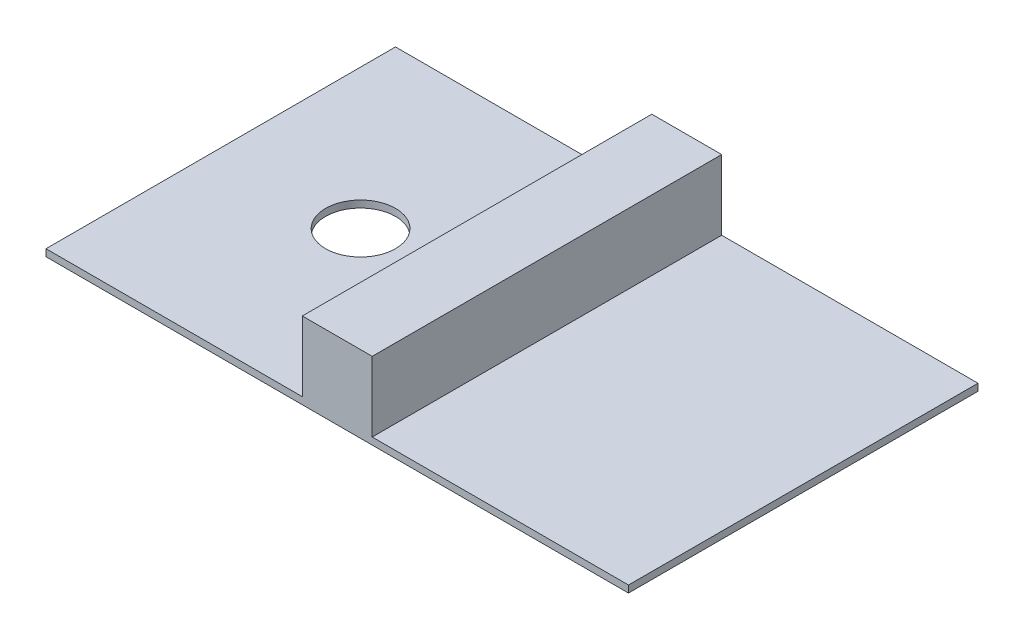
ISO-10303-21;
HEADER;
FILE_DESCRIPTION(('STEP AP214'),'2;1');
FILE_NAME('part.step','',(''),(''),'','','');
FILE_SCHEMA(('AUTOMOTIVE_DESIGN { 1 0 10303 214 1 1 1 1 }'));
ENDSEC;
DATA;
#1=APPLICATION_CONTEXT('core data for automotive mechanical design processes');
#2=APPLICATION_PROTOCOL_DEFINITION('international standard','automotive_design',2000,#1);
#3=PRODUCT_CONTEXT('',#1,'mechanical');
#4=PRODUCT('Part','Part','',(#3));
#5=PRODUCT_RELATED_PRODUCT_CATEGORY('part','',(#4));
#6=PRODUCT_DEFINITION_FORMATION('','',#4);
#7=PRODUCT_DEFINITION_CONTEXT('part definition',#1,'design');
#8=PRODUCT_DEFINITION('design','',#6,#7);
#9=PRODUCT_DEFINITION_SHAPE('','',#8);
#10=(LENGTH_UNIT() NAMED_UNIT(*) SI_UNIT(.MILLI.,.METRE.));
#11=(NAMED_UNIT(*) PLANE_ANGLE_UNIT() SI_UNIT($,.RADIAN.));
#12=(NAMED_UNIT(*) SI_UNIT($,.STERADIAN.) SOLID_ANGLE_UNIT());
#13=UNCERTAINTY_MEASURE_WITH_UNIT(LENGTH_MEASURE(1.E-05),#10,'distance_accuracy_value','');
#14=(GEOMETRIC_REPRESENTATION_CONTEXT(3) GLOBAL_UNCERTAINTY_ASSIGNED_CONTEXT((#13)) GLOBAL_UNIT_ASSIGNED_CONTEXT((#10,
#11,#12)) REPRESENTATION_CONTEXT('',''));
#15=CARTESIAN_POINT('',(0.,0.,0.));
#16=DIRECTION('',(0.,0.,1.));
#17=DIRECTION('',(1.,0.,0.));
#18=AXIS2_PLACEMENT_3D('',#15,#16,#17);
#19=CARTESIAN_POINT('',(0.,0.3,0.));
#20=DIRECTION('',(0.,-1.,0.));
#21=DIRECTION('',(0.,0.,-1.));
#22=AXIS2_PLACEMENT_3D('',#19,#20,#21);
#23=PLANE('',#22);
#24=CARTESIAN_POINT('',(6.,0.3,-7.5));
#25=DIRECTION('',(0.,1.,0.));
#26=DIRECTION('',(0.,0.,1.));
#27=AXIS2_PLACEMENT_3D('',#24,#25,#26);
#28=CIRCLE('',#27,1.5);
#29=CARTESIAN_POINT('',(6.,0.3,-6.));
#30=VERTEX_POINT('',#29);
#31=EDGE_CURVE('E127',#30,#30,#28,.T.);
#32=ORIENTED_EDGE('',*,*,#31,.F.);
#33=EDGE_LOOP('',(#32));
#34=FACE_BOUND('',#33,.T.);
#35=DIRECTION('',(0.,0.,1.));
#36=VECTOR('',#35,1.);
#37=CARTESIAN_POINT('',(11.,0.3,0.));
#38=LINE('',#37,#36);
#39=CARTESIAN_POINT('',(11.,0.3,-15.));
#40=VERTEX_POINT('',#39);
#41=CARTESIAN_POINT('',(11.,0.3,0.));
#42=VERTEX_POINT('',#41);
#43=EDGE_CURVE('E51',#40,#42,#38,.T.);
#44=ORIENTED_EDGE('',*,*,#43,.F.);
#45=DIRECTION('',(-1.,0.,0.));
#46=VECTOR('',#45,1.);
#47=CARTESIAN_POINT('',(0.,0.3,-15.));
#48=LINE('',#47,#46);
#49=CARTESIAN_POINT('',(0.,0.3,-15.));
#50=VERTEX_POINT('',#49);
#51=EDGE_CURVE('E147',#40,#50,#48,.T.);
#52=ORIENTED_EDGE('',*,*,#51,.T.);
#53=DIRECTION('',(0.,0.,1.));
#54=VECTOR('',#53,1.);
#55=CARTESIAN_POINT('',(0.,0.3,0.));
#56=LINE('',#55,#54);
#57=CARTESIAN_POINT('',(0.,0.3,0.));
#58=VERTEX_POINT('',#57);
#59=EDGE_CURVE('E138',#50,#58,#56,.T.);
#60=ORIENTED_EDGE('',*,*,#59,.T.);
#61=DIRECTION('',(1.,0.,0.));
#62=VECTOR('',#61,1.);
#63=CARTESIAN_POINT('',(0.,0.3,0.));
#64=LINE('',#63,#62);
#65=EDGE_CURVE('E143',#58,#42,#64,.T.);
#66=ORIENTED_EDGE('',*,*,#65,.T.);
#67=EDGE_LOOP('',(#44,#52,#60,#66));
#68=FACE_BOUND('',#67,.T.);
#69=ADVANCED_FACE('F35',(#34,#68),#23,.F.);
#70=CARTESIAN_POINT('',(0.,0.3,0.));
#71=DIRECTION('',(1.,0.,0.));
#72=DIRECTION('',(0.,0.,-1.));
#73=AXIS2_PLACEMENT_3D('',#70,#71,#72);
#74=PLANE('',#73);
#75=DIRECTION('',(0.,0.,1.));
#76=VECTOR('',#75,1.);
#77=CARTESIAN_POINT('',(0.,0.,0.));
#78=LINE('',#77,#76);
#79=CARTESIAN_POINT('',(0.,0.,-15.));
#80=VERTEX_POINT('',#79);
#81=CARTESIAN_POINT('',(0.,0.,0.));
#82=VERTEX_POINT('',#81);
#83=EDGE_CURVE('E109',#80,#82,#78,.T.);
#84=ORIENTED_EDGE('',*,*,#83,.T.);
#85=DIRECTION('',(0.,-1.,0.));
#86=VECTOR('',#85,1.);
#87=CARTESIAN_POINT('',(0.,0.3,0.));
#88=LINE('',#87,#86);
#89=EDGE_CURVE('E11',#58,#82,#88,.T.);
#90=ORIENTED_EDGE('',*,*,#89,.F.);
#91=ORIENTED_EDGE('',*,*,#59,.F.);
#92=DIRECTION('',(0.,-1.,0.));
#93=VECTOR('',#92,1.);
#94=CARTESIAN_POINT('',(0.,0.3,-15.));
#95=LINE('',#94,#93);
#96=EDGE_CURVE('E149',#50,#80,#95,.T.);
#97=ORIENTED_EDGE('',*,*,#96,.T.);
#98=EDGE_LOOP('',(#84,#90,#91,#97));
#99=FACE_BOUND('',#98,.T.);
#100=ADVANCED_FACE('F37',(#99),#74,.F.);
#101=CARTESIAN_POINT('',(0.,0.3,0.));
#102=DIRECTION('',(0.,0.,-1.));
#103=DIRECTION('',(-1.,0.,0.));
#104=AXIS2_PLACEMENT_3D('',#101,#102,#103);
#105=PLANE('',#104);
#106=DIRECTION('',(1.,0.,0.));
#107=VECTOR('',#106,1.);
#108=CARTESIAN_POINT('',(0.,0.,0.));
#109=LINE('',#108,#107);
#110=CARTESIAN_POINT('',(25.,0.,0.));
#111=VERTEX_POINT('',#110);
#112=EDGE_CURVE('E152',#82,#111,#109,.T.);
#113=ORIENTED_EDGE('',*,*,#112,.T.);
#114=DIRECTION('',(0.,-1.,0.));
#115=VECTOR('',#114,1.);
#116=CARTESIAN_POINT('',(25.,0.3,0.));
#117=LINE('',#116,#115);
#118=CARTESIAN_POINT('',(25.,0.3,0.));
#119=VERTEX_POINT('',#118);
#120=EDGE_CURVE('E44',#119,#111,#117,.T.);
#121=ORIENTED_EDGE('',*,*,#120,.F.);
#122=CARTESIAN_POINT('',(14.,0.3,0.));
#123=VERTEX_POINT('',#122);
#124=EDGE_CURVE('E141',#123,#119,#64,.T.);
#125=ORIENTED_EDGE('',*,*,#124,.F.);
#126=DIRECTION('',(0.,-1.,0.));
#127=VECTOR('',#126,1.);
#128=CARTESIAN_POINT('',(14.,3.3,0.));
#129=LINE('',#128,#127);
#130=CARTESIAN_POINT('',(14.,3.3,0.));
#131=VERTEX_POINT('',#130);
#132=EDGE_CURVE('E131',#131,#123,#129,.T.);
#133=ORIENTED_EDGE('',*,*,#132,.F.);
#134=DIRECTION('',(1.,0.,0.));
#135=VECTOR('',#134,1.);
#136=CARTESIAN_POINT('',(0.,3.3,0.));
#137=LINE('',#136,#135);
#138=CARTESIAN_POINT('',(11.,3.3,0.));
#139=VERTEX_POINT('',#138);
#140=EDGE_CURVE('E122',#139,#131,#137,.T.);
#141=ORIENTED_EDGE('',*,*,#140,.F.);
#142=DIRECTION('',(0.,-1.,0.));
#143=VECTOR('',#142,1.);
#144=CARTESIAN_POINT('',(11.,3.3,0.));
#145=LINE('',#144,#143);
#146=EDGE_CURVE('E134',#139,#42,#145,.T.);
#147=ORIENTED_EDGE('',*,*,#146,.T.);
#148=ORIENTED_EDGE('',*,*,#65,.F.);
#149=ORIENTED_EDGE('',*,*,#89,.T.);
#150=EDGE_LOOP('',(#113,#121,#125,#133,#141,#147,#148,#149));
#151=FACE_BOUND('',#150,.T.);
#152=ADVANCED_FACE('F182',(#151),#105,.F.);
#153=CARTESIAN_POINT('',(25.,0.3,0.));
#154=DIRECTION('',(-1.,0.,0.));
#155=DIRECTION('',(0.,0.,1.));
#156=AXIS2_PLACEMENT_3D('',#153,#154,#155);
#157=PLANE('',#156);
#158=DIRECTION('',(0.,0.,-1.));
#159=VECTOR('',#158,1.);
#160=CARTESIAN_POINT('',(25.,0.,0.));
#161=LINE('',#160,#159);
#162=CARTESIAN_POINT('',(25.,0.,-15.));
#163=VERTEX_POINT('',#162);
#164=EDGE_CURVE('E154',#111,#163,#161,.T.);
#165=ORIENTED_EDGE('',*,*,#164,.T.);
#166=DIRECTION('',(0.,-1.,0.));
#167=VECTOR('',#166,1.);
#168=CARTESIAN_POINT('',(25.,0.3,-15.));
#169=LINE('',#168,#167);
#170=CARTESIAN_POINT('',(25.,0.3,-15.));
#171=VERTEX_POINT('',#170);
#172=EDGE_CURVE('E159',#171,#163,#169,.T.);
#173=ORIENTED_EDGE('',*,*,#172,.F.);
#174=DIRECTION('',(0.,0.,-1.));
#175=VECTOR('',#174,1.);
#176=CARTESIAN_POINT('',(25.,0.3,0.));
#177=LINE('',#176,#175);
#178=EDGE_CURVE('E145',#119,#171,#177,.T.);
#179=ORIENTED_EDGE('',*,*,#178,.F.);
#180=ORIENTED_EDGE('',*,*,#120,.T.);
#181=EDGE_LOOP('',(#165,#173,#179,#180));
#182=FACE_BOUND('',#181,.T.);
#183=ADVANCED_FACE('F167',(#182),#157,.F.);
#184=CARTESIAN_POINT('',(0.,0.3,-15.));
#185=DIRECTION('',(0.,0.,1.));
#186=DIRECTION('',(1.,0.,0.));
#187=AXIS2_PLACEMENT_3D('',#184,#185,#186);
#188=PLANE('',#187);
#189=DIRECTION('',(-1.,0.,0.));
#190=VECTOR('',#189,1.);
#191=CARTESIAN_POINT('',(0.,0.,-15.));
#192=LINE('',#191,#190);
#193=EDGE_CURVE('E142',#163,#80,#192,.T.);
#194=ORIENTED_EDGE('',*,*,#193,.T.);
#195=ORIENTED_EDGE('',*,*,#96,.F.);
#196=ORIENTED_EDGE('',*,*,#51,.F.);
#197=DIRECTION('',(0.,-1.,0.));
#198=VECTOR('',#197,1.);
#199=CARTESIAN_POINT('',(11.,3.3,-15.));
#200=LINE('',#199,#198);
#201=CARTESIAN_POINT('',(11.,3.3,-15.));
#202=VERTEX_POINT('',#201);
#203=EDGE_CURVE('E110',#202,#40,#200,.T.);
#204=ORIENTED_EDGE('',*,*,#203,.F.);
#205=DIRECTION('',(-1.,0.,0.));
#206=VECTOR('',#205,1.);
#207=CARTESIAN_POINT('',(0.,3.3,-15.));
#208=LINE('',#207,#206);
#209=CARTESIAN_POINT('',(14.,3.3,-15.));
#210=VERTEX_POINT('',#209);
#211=EDGE_CURVE('E113',#210,#202,#208,.T.);
#212=ORIENTED_EDGE('',*,*,#211,.F.);
#213=DIRECTION('',(0.,-1.,0.));
#214=VECTOR('',#213,1.);
#215=CARTESIAN_POINT('',(14.,3.3,-15.));
#216=LINE('',#215,#214);
#217=CARTESIAN_POINT('',(14.,0.3,-15.));
#218=VERTEX_POINT('',#217);
#219=EDGE_CURVE('E101',#210,#218,#216,.T.);
#220=ORIENTED_EDGE('',*,*,#219,.T.);
#221=EDGE_CURVE('E59',#171,#218,#48,.T.);
#222=ORIENTED_EDGE('',*,*,#221,.F.);
#223=ORIENTED_EDGE('',*,*,#172,.T.);
#224=EDGE_LOOP('',(#194,#195,#196,#204,#212,#220,#222,#223));
#225=FACE_BOUND('',#224,.T.);
#226=ADVANCED_FACE('F114',(#225),#188,.F.);
#227=ORIENTED_EDGE('',*,*,#221,.T.);
#228=DIRECTION('',(0.,0.,1.));
#229=VECTOR('',#228,1.);
#230=CARTESIAN_POINT('',(14.,0.3,0.));
#231=LINE('',#230,#229);
#232=EDGE_CURVE('E107',#218,#123,#231,.T.);
#233=ORIENTED_EDGE('',*,*,#232,.T.);
#234=ORIENTED_EDGE('',*,*,#124,.T.);
#235=ORIENTED_EDGE('',*,*,#178,.T.);
#236=EDGE_LOOP('',(#227,#233,#234,#235));
#237=FACE_BOUND('',#236,.T.);
#238=ADVANCED_FACE('F183',(#237),#23,.F.);
#239=CARTESIAN_POINT('',(0.,0.,0.));
#240=DIRECTION('',(0.,-1.,0.));
#241=DIRECTION('',(0.,0.,-1.));
#242=AXIS2_PLACEMENT_3D('',#239,#240,#241);
#243=PLANE('',#242);
#244=CARTESIAN_POINT('',(6.,0.,-7.5));
#245=DIRECTION('',(0.,-1.,0.));
#246=DIRECTION('',(0.,0.,-1.));
#247=AXIS2_PLACEMENT_3D('',#244,#245,#246);
#248=CIRCLE('',#247,1.5);
#249=CARTESIAN_POINT('',(6.,0.,-9.));
#250=VERTEX_POINT('',#249);
#251=EDGE_CURVE('E39',#250,#250,#248,.T.);
#252=ORIENTED_EDGE('',*,*,#251,.F.);
#253=EDGE_LOOP('',(#252));
#254=FACE_BOUND('',#253,.T.);
#255=ORIENTED_EDGE('',*,*,#83,.F.);
#256=ORIENTED_EDGE('',*,*,#193,.F.);
#257=ORIENTED_EDGE('',*,*,#164,.F.);
#258=ORIENTED_EDGE('',*,*,#112,.F.);
#259=EDGE_LOOP('',(#255,#256,#257,#258));
#260=FACE_BOUND('',#259,.T.);
#261=ADVANCED_FACE('F174',(#254,#260),#243,.T.);
#262=CARTESIAN_POINT('',(14.,3.3,0.));
#263=DIRECTION('',(1.,0.,0.));
#264=DIRECTION('',(0.,0.,-1.));
#265=AXIS2_PLACEMENT_3D('',#262,#263,#264);
#266=PLANE('',#265);
#267=ORIENTED_EDGE('',*,*,#232,.F.);
#268=ORIENTED_EDGE('',*,*,#219,.F.);
#269=DIRECTION('',(0.,0.,1.));
#270=VECTOR('',#269,1.);
#271=CARTESIAN_POINT('',(14.,3.3,0.));
#272=LINE('',#271,#270);
#273=EDGE_CURVE('E106',#210,#131,#272,.T.);
#274=ORIENTED_EDGE('',*,*,#273,.T.);
#275=ORIENTED_EDGE('',*,*,#132,.T.);
#276=EDGE_LOOP('',(#267,#268,#274,#275));
#277=FACE_BOUND('',#276,.T.);
#278=ADVANCED_FACE('F103',(#277),#266,.T.);
#279=CARTESIAN_POINT('',(11.,3.3,0.));
#280=DIRECTION('',(1.,0.,0.));
#281=DIRECTION('',(0.,0.,-1.));
#282=AXIS2_PLACEMENT_3D('',#279,#280,#281);
#283=PLANE('',#282);
#284=ORIENTED_EDGE('',*,*,#43,.T.);
#285=ORIENTED_EDGE('',*,*,#146,.F.);
#286=DIRECTION('',(0.,0.,1.));
#287=VECTOR('',#286,1.);
#288=CARTESIAN_POINT('',(11.,3.3,0.));
#289=LINE('',#288,#287);
#290=EDGE_CURVE('E118',#202,#139,#289,.T.);
#291=ORIENTED_EDGE('',*,*,#290,.F.);
#292=ORIENTED_EDGE('',*,*,#203,.T.);
#293=EDGE_LOOP('',(#284,#285,#291,#292));
#294=FACE_BOUND('',#293,.T.);
#295=ADVANCED_FACE('F180',(#294),#283,.F.);
#296=CARTESIAN_POINT('',(0.,3.3,0.));
#297=DIRECTION('',(0.,1.,0.));
#298=DIRECTION('',(0.,0.,1.));
#299=AXIS2_PLACEMENT_3D('',#296,#297,#298);
#300=PLANE('',#299);
#301=ORIENTED_EDGE('',*,*,#273,.F.);
#302=ORIENTED_EDGE('',*,*,#211,.T.);
#303=ORIENTED_EDGE('',*,*,#290,.T.);
#304=ORIENTED_EDGE('',*,*,#140,.T.);
#305=EDGE_LOOP('',(#301,#302,#303,#304));
#306=FACE_BOUND('',#305,.T.);
#307=ADVANCED_FACE('F120',(#306),#300,.T.);
#308=CARTESIAN_POINT('',(6.,-2.7,-7.5));
#309=DIRECTION('',(0.,1.,0.));
#310=DIRECTION('',(0.,0.,1.));
#311=AXIS2_PLACEMENT_3D('',#308,#309,#310);
#312=CYLINDRICAL_SURFACE('',#311,1.5);
#313=ORIENTED_EDGE('',*,*,#251,.T.);
#314=EDGE_LOOP('',(#313));
#315=FACE_BOUND('',#314,.T.);
#316=ORIENTED_EDGE('',*,*,#31,.T.);
#317=EDGE_LOOP('',(#316));
#318=FACE_BOUND('',#317,.T.);
#319=ADVANCED_FACE('F205',(#315,#318),#312,.F.);
#320=CLOSED_SHELL('',(#69,#100,#152,#183,#226,#238,#261,#278,#295,#307,#319));
#321=MANIFOLD_SOLID_BREP('B2',#320);
#322=ADVANCED_BREP_SHAPE_REPRESENTATION('',(#18,#321),#14);
#323=SHAPE_DEFINITION_REPRESENTATION(#9,#322);
ENDSEC;
END-ISO-10303-21;
